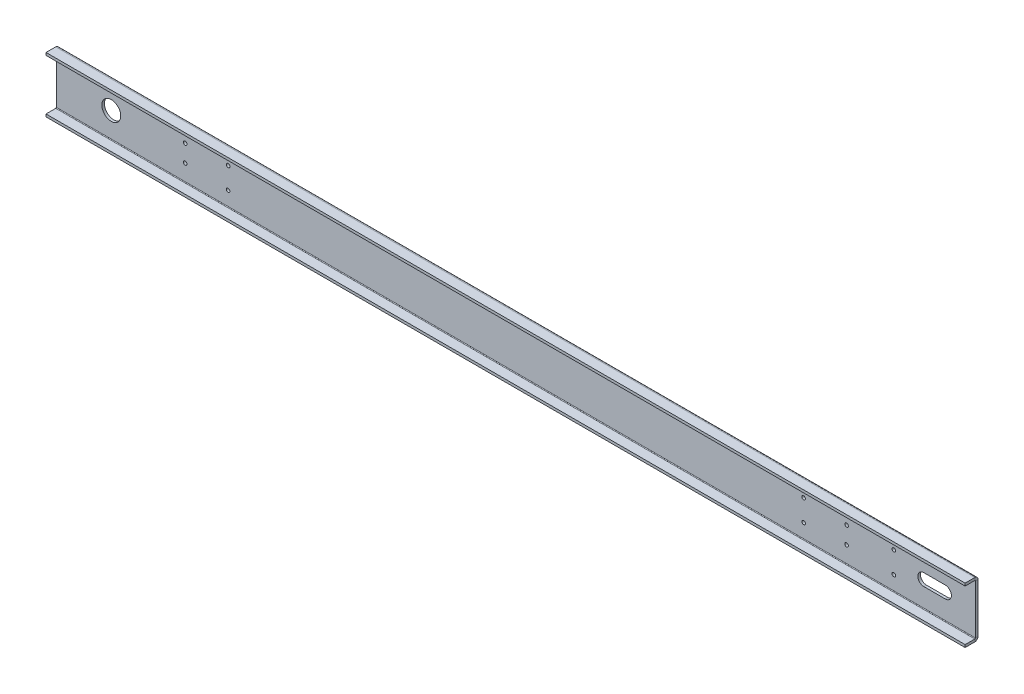
ISO-10303-21;
HEADER;
FILE_DESCRIPTION(('STEP AP214'),'2;1');
FILE_NAME('part.step','',(''),(''),'','','');
FILE_SCHEMA(('AUTOMOTIVE_DESIGN { 1 0 10303 214 1 1 1 1 }'));
ENDSEC;
DATA;
#1=APPLICATION_CONTEXT('core data for automotive mechanical design processes');
#2=APPLICATION_PROTOCOL_DEFINITION('international standard','automotive_design',2000,#1);
#3=PRODUCT_CONTEXT('',#1,'mechanical');
#4=PRODUCT('Part','Part','',(#3));
#5=PRODUCT_RELATED_PRODUCT_CATEGORY('part','',(#4));
#6=PRODUCT_DEFINITION_FORMATION('','',#4);
#7=PRODUCT_DEFINITION_CONTEXT('part definition',#1,'design');
#8=PRODUCT_DEFINITION('design','',#6,#7);
#9=PRODUCT_DEFINITION_SHAPE('','',#8);
#10=(LENGTH_UNIT() NAMED_UNIT(*) SI_UNIT(.MILLI.,.METRE.));
#11=(NAMED_UNIT(*) PLANE_ANGLE_UNIT() SI_UNIT($,.RADIAN.));
#12=(NAMED_UNIT(*) SI_UNIT($,.STERADIAN.) SOLID_ANGLE_UNIT());
#13=UNCERTAINTY_MEASURE_WITH_UNIT(LENGTH_MEASURE(1.E-05),#10,'distance_accuracy_value','');
#14=(GEOMETRIC_REPRESENTATION_CONTEXT(3) GLOBAL_UNCERTAINTY_ASSIGNED_CONTEXT((#13)) GLOBAL_UNIT_ASSIGNED_CONTEXT((#10,
#11,#12)) REPRESENTATION_CONTEXT('',''));
#15=CARTESIAN_POINT('',(0.,0.,0.));
#16=DIRECTION('',(0.,0.,1.));
#17=DIRECTION('',(1.,0.,0.));
#18=AXIS2_PLACEMENT_3D('',#15,#16,#17);
#19=CARTESIAN_POINT('',(535.,28.7634,0.));
#20=DIRECTION('',(1.,0.,0.));
#21=DIRECTION('',(0.,0.,-1.));
#22=AXIS2_PLACEMENT_3D('',#19,#20,#21);
#23=PLANE('',#22);
#24=DIRECTION('',(0.,0.,1.));
#25=VECTOR('',#24,1.);
#26=CARTESIAN_POINT('',(535.,28.7634,0.));
#27=LINE('',#26,#25);
#28=CARTESIAN_POINT('',(535.,28.7634,0.));
#29=VERTEX_POINT('',#28);
#30=CARTESIAN_POINT('',(535.,28.7634,3.));
#31=VERTEX_POINT('',#30);
#32=EDGE_CURVE('E300',#29,#31,#27,.T.);
#33=ORIENTED_EDGE('',*,*,#32,.F.);
#34=CARTESIAN_POINT('',(535.,28.7634,3.7366));
#35=DIRECTION('',(1.,0.,0.));
#36=DIRECTION('',(0.,0.,-1.));
#37=AXIS2_PLACEMENT_3D('',#34,#35,#36);
#38=CIRCLE('',#37,3.7366);
#39=CARTESIAN_POINT('',(535.,32.5,3.7366));
#40=VERTEX_POINT('',#39);
#41=EDGE_CURVE('E199',#40,#29,#38,.F.);
#42=ORIENTED_EDGE('',*,*,#41,.F.);
#43=DIRECTION('',(0.,1.,0.));
#44=VECTOR('',#43,1.);
#45=CARTESIAN_POINT('',(535.,29.5,3.7366));
#46=LINE('',#45,#44);
#47=CARTESIAN_POINT('',(535.,29.5,3.7366));
#48=VERTEX_POINT('',#47);
#49=EDGE_CURVE('E298',#48,#40,#46,.T.);
#50=ORIENTED_EDGE('',*,*,#49,.F.);
#51=CARTESIAN_POINT('',(535.,28.7634,3.7366));
#52=DIRECTION('',(1.,0.,0.));
#53=DIRECTION('',(0.,0.,-1.));
#54=AXIS2_PLACEMENT_3D('',#51,#52,#53);
#55=CIRCLE('',#54,0.7366);
#56=EDGE_CURVE('E211',#48,#31,#55,.F.);
#57=ORIENTED_EDGE('',*,*,#56,.T.);
#58=EDGE_LOOP('',(#33,#42,#50,#57));
#59=FACE_BOUND('',#58,.T.);
#60=ADVANCED_FACE('F41',(#59),#23,.T.);
#61=CARTESIAN_POINT('',(535.,29.5,3.7366));
#62=DIRECTION('',(1.,0.,0.));
#63=DIRECTION('',(0.,0.,-1.));
#64=AXIS2_PLACEMENT_3D('',#61,#62,#63);
#65=PLANE('',#64);
#66=DIRECTION('',(0.,-1.,0.));
#67=VECTOR('',#66,1.);
#68=CARTESIAN_POINT('',(535.,-32.5,0.));
#69=LINE('',#68,#67);
#70=CARTESIAN_POINT('',(535.,-28.7634,0.));
#71=VERTEX_POINT('',#70);
#72=EDGE_CURVE('E196',#29,#71,#69,.T.);
#73=ORIENTED_EDGE('',*,*,#72,.F.);
#74=ORIENTED_EDGE('',*,*,#32,.T.);
#75=DIRECTION('',(0.,1.,0.));
#76=VECTOR('',#75,1.);
#77=CARTESIAN_POINT('',(535.,-32.5,3.));
#78=LINE('',#77,#76);
#79=CARTESIAN_POINT('',(535.,-28.7634,3.));
#80=VERTEX_POINT('',#79);
#81=EDGE_CURVE('E214',#31,#80,#78,.F.);
#82=ORIENTED_EDGE('',*,*,#81,.T.);
#83=DIRECTION('',(0.,0.,-1.));
#84=VECTOR('',#83,1.);
#85=CARTESIAN_POINT('',(535.,-28.7634,3.));
#86=LINE('',#85,#84);
#87=EDGE_CURVE('E290',#80,#71,#86,.T.);
#88=ORIENTED_EDGE('',*,*,#87,.T.);
#89=EDGE_LOOP('',(#73,#74,#82,#88));
#90=FACE_BOUND('',#89,.T.);
#91=ADVANCED_FACE('F392',(#90),#65,.T.);
#92=CARTESIAN_POINT('',(-535.,32.5,3.7366));
#93=DIRECTION('',(-1.,0.,0.));
#94=DIRECTION('',(0.,0.,1.));
#95=AXIS2_PLACEMENT_3D('',#92,#93,#94);
#96=PLANE('',#95);
#97=DIRECTION('',(0.,-1.,0.));
#98=VECTOR('',#97,1.);
#99=CARTESIAN_POINT('',(-535.,32.5,3.7366));
#100=LINE('',#99,#98);
#101=CARTESIAN_POINT('',(-535.,32.5,3.7366));
#102=VERTEX_POINT('',#101);
#103=CARTESIAN_POINT('',(-535.,29.5,3.7366));
#104=VERTEX_POINT('',#103);
#105=EDGE_CURVE('E296',#102,#104,#100,.T.);
#106=ORIENTED_EDGE('',*,*,#105,.F.);
#107=CARTESIAN_POINT('',(-535.,28.7634,3.7366));
#108=DIRECTION('',(1.,0.,0.));
#109=DIRECTION('',(0.,0.,-1.));
#110=AXIS2_PLACEMENT_3D('',#107,#108,#109);
#111=CIRCLE('',#110,3.7366);
#112=CARTESIAN_POINT('',(-535.,28.7634,0.));
#113=VERTEX_POINT('',#112);
#114=EDGE_CURVE('E235',#102,#113,#111,.F.);
#115=ORIENTED_EDGE('',*,*,#114,.T.);
#116=DIRECTION('',(0.,0.,-1.));
#117=VECTOR('',#116,1.);
#118=CARTESIAN_POINT('',(-535.,28.7634,3.));
#119=LINE('',#118,#117);
#120=CARTESIAN_POINT('',(-535.,28.7634,3.));
#121=VERTEX_POINT('',#120);
#122=EDGE_CURVE('E294',#121,#113,#119,.T.);
#123=ORIENTED_EDGE('',*,*,#122,.F.);
#124=CARTESIAN_POINT('',(-535.,28.7634,3.7366));
#125=DIRECTION('',(1.,0.,0.));
#126=DIRECTION('',(0.,0.,-1.));
#127=AXIS2_PLACEMENT_3D('',#124,#125,#126);
#128=CIRCLE('',#127,0.7366);
#129=EDGE_CURVE('E247',#104,#121,#128,.F.);
#130=ORIENTED_EDGE('',*,*,#129,.F.);
#131=EDGE_LOOP('',(#106,#115,#123,#130));
#132=FACE_BOUND('',#131,.T.);
#133=ADVANCED_FACE('F397',(#132),#96,.T.);
#134=CARTESIAN_POINT('',(-535.,28.7634,3.));
#135=DIRECTION('',(-1.,0.,0.));
#136=DIRECTION('',(0.,0.,1.));
#137=AXIS2_PLACEMENT_3D('',#134,#135,#136);
#138=PLANE('',#137);
#139=DIRECTION('',(0.,0.,-1.));
#140=VECTOR('',#139,1.);
#141=CARTESIAN_POINT('',(-535.,32.5,0.));
#142=LINE('',#141,#140);
#143=CARTESIAN_POINT('',(-535.,32.5,15.));
#144=VERTEX_POINT('',#143);
#145=EDGE_CURVE('E238',#144,#102,#142,.T.);
#146=ORIENTED_EDGE('',*,*,#145,.T.);
#147=ORIENTED_EDGE('',*,*,#105,.T.);
#148=DIRECTION('',(0.,0.,-1.));
#149=VECTOR('',#148,1.);
#150=CARTESIAN_POINT('',(-535.,29.5,0.));
#151=LINE('',#150,#149);
#152=CARTESIAN_POINT('',(-535.,29.5,15.));
#153=VERTEX_POINT('',#152);
#154=EDGE_CURVE('E244',#153,#104,#151,.T.);
#155=ORIENTED_EDGE('',*,*,#154,.F.);
#156=DIRECTION('',(0.,1.,0.));
#157=VECTOR('',#156,1.);
#158=CARTESIAN_POINT('',(-535.,29.5,15.));
#159=LINE('',#158,#157);
#160=EDGE_CURVE('E241',#153,#144,#159,.T.);
#161=ORIENTED_EDGE('',*,*,#160,.T.);
#162=EDGE_LOOP('',(#146,#147,#155,#161));
#163=FACE_BOUND('',#162,.T.);
#164=ADVANCED_FACE('F451',(#163),#138,.T.);
#165=CARTESIAN_POINT('',(535.,-32.5,3.7366));
#166=DIRECTION('',(1.,0.,0.));
#167=DIRECTION('',(0.,0.,-1.));
#168=AXIS2_PLACEMENT_3D('',#165,#166,#167);
#169=PLANE('',#168);
#170=DIRECTION('',(0.,1.,0.));
#171=VECTOR('',#170,1.);
#172=CARTESIAN_POINT('',(535.,-32.5,3.7366));
#173=LINE('',#172,#171);
#174=CARTESIAN_POINT('',(535.,-32.5,3.7366));
#175=VERTEX_POINT('',#174);
#176=CARTESIAN_POINT('',(535.,-29.5,3.7366));
#177=VERTEX_POINT('',#176);
#178=EDGE_CURVE('E292',#175,#177,#173,.T.);
#179=ORIENTED_EDGE('',*,*,#178,.F.);
#180=CARTESIAN_POINT('',(535.,-28.7634,3.7366));
#181=DIRECTION('',(1.,0.,0.));
#182=DIRECTION('',(0.,0.,-1.));
#183=AXIS2_PLACEMENT_3D('',#180,#181,#182);
#184=CIRCLE('',#183,3.7366);
#185=EDGE_CURVE('E193',#71,#175,#184,.F.);
#186=ORIENTED_EDGE('',*,*,#185,.F.);
#187=ORIENTED_EDGE('',*,*,#87,.F.);
#188=CARTESIAN_POINT('',(535.,-28.7634,3.7366));
#189=DIRECTION('',(1.,0.,0.));
#190=DIRECTION('',(0.,0.,-1.));
#191=AXIS2_PLACEMENT_3D('',#188,#189,#190);
#192=CIRCLE('',#191,0.7366);
#193=EDGE_CURVE('E217',#80,#177,#192,.F.);
#194=ORIENTED_EDGE('',*,*,#193,.T.);
#195=EDGE_LOOP('',(#179,#186,#187,#194));
#196=FACE_BOUND('',#195,.T.);
#197=ADVANCED_FACE('F439',(#196),#169,.T.);
#198=CARTESIAN_POINT('',(535.,-28.7634,3.));
#199=DIRECTION('',(1.,0.,0.));
#200=DIRECTION('',(0.,0.,-1.));
#201=AXIS2_PLACEMENT_3D('',#198,#199,#200);
#202=PLANE('',#201);
#203=DIRECTION('',(0.,0.,1.));
#204=VECTOR('',#203,1.);
#205=CARTESIAN_POINT('',(535.,-32.5,0.));
#206=LINE('',#205,#204);
#207=CARTESIAN_POINT('',(535.,-32.5,15.));
#208=VERTEX_POINT('',#207);
#209=EDGE_CURVE('E190',#175,#208,#206,.T.);
#210=ORIENTED_EDGE('',*,*,#209,.F.);
#211=ORIENTED_EDGE('',*,*,#178,.T.);
#212=DIRECTION('',(0.,0.,-1.));
#213=VECTOR('',#212,1.);
#214=CARTESIAN_POINT('',(535.,-29.5,0.));
#215=LINE('',#214,#213);
#216=CARTESIAN_POINT('',(535.,-29.5,15.));
#217=VERTEX_POINT('',#216);
#218=EDGE_CURVE('E184',#177,#217,#215,.F.);
#219=ORIENTED_EDGE('',*,*,#218,.T.);
#220=DIRECTION('',(0.,1.,0.));
#221=VECTOR('',#220,1.);
#222=CARTESIAN_POINT('',(535.,-32.5,15.));
#223=LINE('',#222,#221);
#224=EDGE_CURVE('E186',#208,#217,#223,.T.);
#225=ORIENTED_EDGE('',*,*,#224,.F.);
#226=EDGE_LOOP('',(#210,#211,#219,#225));
#227=FACE_BOUND('',#226,.T.);
#228=ADVANCED_FACE('F458',(#227),#202,.T.);
#229=CARTESIAN_POINT('',(-535.,-28.7634,0.));
#230=DIRECTION('',(-1.,0.,0.));
#231=DIRECTION('',(0.,0.,1.));
#232=AXIS2_PLACEMENT_3D('',#229,#230,#231);
#233=PLANE('',#232);
#234=DIRECTION('',(0.,0.,1.));
#235=VECTOR('',#234,1.);
#236=CARTESIAN_POINT('',(-535.,-28.7634,0.));
#237=LINE('',#236,#235);
#238=CARTESIAN_POINT('',(-535.,-28.7634,0.));
#239=VERTEX_POINT('',#238);
#240=CARTESIAN_POINT('',(-535.,-28.7634,3.));
#241=VERTEX_POINT('',#240);
#242=EDGE_CURVE('E288',#239,#241,#237,.T.);
#243=ORIENTED_EDGE('',*,*,#242,.F.);
#244=CARTESIAN_POINT('',(-535.,-28.7634,3.7366));
#245=DIRECTION('',(1.,0.,0.));
#246=DIRECTION('',(0.,0.,-1.));
#247=AXIS2_PLACEMENT_3D('',#244,#245,#246);
#248=CIRCLE('',#247,3.7366);
#249=CARTESIAN_POINT('',(-535.,-32.5,3.7366));
#250=VERTEX_POINT('',#249);
#251=EDGE_CURVE('E229',#239,#250,#248,.F.);
#252=ORIENTED_EDGE('',*,*,#251,.T.);
#253=DIRECTION('',(0.,-1.,0.));
#254=VECTOR('',#253,1.);
#255=CARTESIAN_POINT('',(-535.,-29.5,3.7366));
#256=LINE('',#255,#254);
#257=CARTESIAN_POINT('',(-535.,-29.5,3.7366));
#258=VERTEX_POINT('',#257);
#259=EDGE_CURVE('E286',#258,#250,#256,.T.);
#260=ORIENTED_EDGE('',*,*,#259,.F.);
#261=CARTESIAN_POINT('',(-535.,-28.7634,3.7366));
#262=DIRECTION('',(1.,0.,0.));
#263=DIRECTION('',(0.,0.,-1.));
#264=AXIS2_PLACEMENT_3D('',#261,#262,#263);
#265=CIRCLE('',#264,0.7366);
#266=EDGE_CURVE('E187',#241,#258,#265,.F.);
#267=ORIENTED_EDGE('',*,*,#266,.F.);
#268=EDGE_LOOP('',(#243,#252,#260,#267));
#269=FACE_BOUND('',#268,.T.);
#270=ADVANCED_FACE('F464',(#269),#233,.T.);
#271=CARTESIAN_POINT('',(-535.,-29.5,3.7366));
#272=DIRECTION('',(-1.,0.,0.));
#273=DIRECTION('',(0.,0.,1.));
#274=AXIS2_PLACEMENT_3D('',#271,#272,#273);
#275=PLANE('',#274);
#276=DIRECTION('',(0.,-1.,0.));
#277=VECTOR('',#276,1.);
#278=CARTESIAN_POINT('',(-535.,-32.5,0.));
#279=LINE('',#278,#277);
#280=EDGE_CURVE('E232',#113,#239,#279,.T.);
#281=ORIENTED_EDGE('',*,*,#280,.T.);
#282=ORIENTED_EDGE('',*,*,#242,.T.);
#283=DIRECTION('',(0.,1.,0.));
#284=VECTOR('',#283,1.);
#285=CARTESIAN_POINT('',(-535.,-32.5,3.));
#286=LINE('',#285,#284);
#287=EDGE_CURVE('E250',#121,#241,#286,.F.);
#288=ORIENTED_EDGE('',*,*,#287,.F.);
#289=ORIENTED_EDGE('',*,*,#122,.T.);
#290=EDGE_LOOP('',(#281,#282,#288,#289));
#291=FACE_BOUND('',#290,.T.);
#292=ADVANCED_FACE('F448',(#291),#275,.T.);
#293=CARTESIAN_POINT('',(535.,-29.5,0.));
#294=DIRECTION('',(0.,-1.,0.));
#295=DIRECTION('',(0.,0.,-1.));
#296=AXIS2_PLACEMENT_3D('',#293,#294,#295);
#297=PLANE('',#296);
#298=DIRECTION('',(0.,0.,-1.));
#299=VECTOR('',#298,1.);
#300=CARTESIAN_POINT('',(-535.,-29.5,0.));
#301=LINE('',#300,#299);
#302=CARTESIAN_POINT('',(-535.,-29.5,15.));
#303=VERTEX_POINT('',#302);
#304=EDGE_CURVE('E181',#258,#303,#301,.F.);
#305=ORIENTED_EDGE('',*,*,#304,.T.);
#306=DIRECTION('',(-1.,0.,0.));
#307=VECTOR('',#306,1.);
#308=CARTESIAN_POINT('',(535.,-29.5,15.));
#309=LINE('',#308,#307);
#310=EDGE_CURVE('E284',#217,#303,#309,.T.);
#311=ORIENTED_EDGE('',*,*,#310,.F.);
#312=ORIENTED_EDGE('',*,*,#218,.F.);
#313=DIRECTION('',(-1.,0.,0.));
#314=VECTOR('',#313,1.);
#315=CARTESIAN_POINT('',(535.,-29.5,3.7366));
#316=LINE('',#315,#314);
#317=EDGE_CURVE('E220',#177,#258,#316,.T.);
#318=ORIENTED_EDGE('',*,*,#317,.T.);
#319=EDGE_LOOP('',(#305,#311,#312,#318));
#320=FACE_BOUND('',#319,.T.);
#321=ADVANCED_FACE('F470',(#320),#297,.F.);
#322=CARTESIAN_POINT('',(535.,-32.5,15.));
#323=DIRECTION('',(0.,0.,1.));
#324=DIRECTION('',(1.,0.,0.));
#325=AXIS2_PLACEMENT_3D('',#322,#323,#324);
#326=PLANE('',#325);
#327=DIRECTION('',(0.,1.,0.));
#328=VECTOR('',#327,1.);
#329=CARTESIAN_POINT('',(-535.,-32.5,15.));
#330=LINE('',#329,#328);
#331=CARTESIAN_POINT('',(-535.,-32.5,15.));
#332=VERTEX_POINT('',#331);
#333=EDGE_CURVE('E223',#332,#303,#330,.T.);
#334=ORIENTED_EDGE('',*,*,#333,.F.);
#335=DIRECTION('',(-1.,0.,0.));
#336=VECTOR('',#335,1.);
#337=CARTESIAN_POINT('',(535.,-32.5,15.));
#338=LINE('',#337,#336);
#339=EDGE_CURVE('E282',#208,#332,#338,.T.);
#340=ORIENTED_EDGE('',*,*,#339,.F.);
#341=ORIENTED_EDGE('',*,*,#224,.T.);
#342=ORIENTED_EDGE('',*,*,#310,.T.);
#343=EDGE_LOOP('',(#334,#340,#341,#342));
#344=FACE_BOUND('',#343,.T.);
#345=ADVANCED_FACE('F473',(#344),#326,.T.);
#346=CARTESIAN_POINT('',(535.,-32.5,0.));
#347=DIRECTION('',(0.,-1.,0.));
#348=DIRECTION('',(0.,0.,-1.));
#349=AXIS2_PLACEMENT_3D('',#346,#347,#348);
#350=PLANE('',#349);
#351=DIRECTION('',(0.,0.,1.));
#352=VECTOR('',#351,1.);
#353=CARTESIAN_POINT('',(-535.,-32.5,0.));
#354=LINE('',#353,#352);
#355=EDGE_CURVE('E226',#250,#332,#354,.T.);
#356=ORIENTED_EDGE('',*,*,#355,.F.);
#357=DIRECTION('',(-1.,0.,0.));
#358=VECTOR('',#357,1.);
#359=CARTESIAN_POINT('',(535.,-32.5,3.7366));
#360=LINE('',#359,#358);
#361=EDGE_CURVE('E279',#175,#250,#360,.T.);
#362=ORIENTED_EDGE('',*,*,#361,.F.);
#363=ORIENTED_EDGE('',*,*,#209,.T.);
#364=ORIENTED_EDGE('',*,*,#339,.T.);
#365=EDGE_LOOP('',(#356,#362,#363,#364));
#366=FACE_BOUND('',#365,.T.);
#367=ADVANCED_FACE('F477',(#366),#350,.T.);
#368=CARTESIAN_POINT('',(535.,-28.7634,3.7366));
#369=DIRECTION('',(-1.,0.,0.));
#370=DIRECTION('',(0.,0.,1.));
#371=AXIS2_PLACEMENT_3D('',#368,#369,#370);
#372=CYLINDRICAL_SURFACE('',#371,3.7366);
#373=ORIENTED_EDGE('',*,*,#251,.F.);
#374=DIRECTION('',(-1.,0.,0.));
#375=VECTOR('',#374,1.);
#376=CARTESIAN_POINT('',(535.,-28.7634,0.));
#377=LINE('',#376,#375);
#378=EDGE_CURVE('E276',#71,#239,#377,.T.);
#379=ORIENTED_EDGE('',*,*,#378,.F.);
#380=ORIENTED_EDGE('',*,*,#185,.T.);
#381=ORIENTED_EDGE('',*,*,#361,.T.);
#382=EDGE_LOOP('',(#373,#379,#380,#381));
#383=FACE_BOUND('',#382,.T.);
#384=ADVANCED_FACE('F444',(#383),#372,.T.);
#385=CARTESIAN_POINT('',(535.,-32.5,0.));
#386=DIRECTION('',(0.,0.,-1.));
#387=DIRECTION('',(-1.,0.,0.));
#388=AXIS2_PLACEMENT_3D('',#385,#386,#387);
#389=PLANE('',#388);
#390=CARTESIAN_POINT('',(-471.,0.,0.));
#391=DIRECTION('',(0.,0.,-1.));
#392=DIRECTION('',(-1.,0.,0.));
#393=AXIS2_PLACEMENT_3D('',#390,#391,#392);
#394=CIRCLE('',#393,11.);
#395=CARTESIAN_POINT('',(-482.,0.,0.));
#396=VERTEX_POINT('',#395);
#397=EDGE_CURVE('E328',#396,#396,#394,.T.);
#398=ORIENTED_EDGE('',*,*,#397,.F.);
#399=EDGE_LOOP('',(#398));
#400=FACE_BOUND('',#399,.T.);
#401=CARTESIAN_POINT('',(-335.,12.5,0.));
#402=DIRECTION('',(0.,0.,-1.));
#403=DIRECTION('',(-1.,0.,0.));
#404=AXIS2_PLACEMENT_3D('',#401,#402,#403);
#405=CIRCLE('',#404,2.09999999999999);
#406=CARTESIAN_POINT('',(-337.1,12.5,0.));
#407=VERTEX_POINT('',#406);
#408=EDGE_CURVE('E318',#407,#407,#405,.T.);
#409=ORIENTED_EDGE('',*,*,#408,.F.);
#410=EDGE_LOOP('',(#409));
#411=FACE_BOUND('',#410,.T.);
#412=CARTESIAN_POINT('',(-335.,-12.5,0.));
#413=DIRECTION('',(0.,0.,-1.));
#414=DIRECTION('',(-1.,0.,0.));
#415=AXIS2_PLACEMENT_3D('',#412,#413,#414);
#416=CIRCLE('',#415,2.09999999999999);
#417=CARTESIAN_POINT('',(-337.1,-12.5,0.));
#418=VERTEX_POINT('',#417);
#419=EDGE_CURVE('E315',#418,#418,#416,.T.);
#420=ORIENTED_EDGE('',*,*,#419,.F.);
#421=EDGE_LOOP('',(#420));
#422=FACE_BOUND('',#421,.T.);
#423=CARTESIAN_POINT('',(-385.,10.,0.));
#424=DIRECTION('',(0.,0.,-1.));
#425=DIRECTION('',(-1.,0.,0.));
#426=AXIS2_PLACEMENT_3D('',#423,#424,#425);
#427=CIRCLE('',#426,2.09999999999999);
#428=CARTESIAN_POINT('',(-387.1,10.,0.));
#429=VERTEX_POINT('',#428);
#430=EDGE_CURVE('E314',#429,#429,#427,.T.);
#431=ORIENTED_EDGE('',*,*,#430,.F.);
#432=EDGE_LOOP('',(#431));
#433=FACE_BOUND('',#432,.T.);
#434=CARTESIAN_POINT('',(-385.,-10.,0.));
#435=DIRECTION('',(0.,0.,-1.));
#436=DIRECTION('',(-1.,0.,0.));
#437=AXIS2_PLACEMENT_3D('',#434,#435,#436);
#438=CIRCLE('',#437,2.09999999999999);
#439=CARTESIAN_POINT('',(-387.1,-10.,0.));
#440=VERTEX_POINT('',#439);
#441=EDGE_CURVE('E336',#440,#440,#438,.T.);
#442=ORIENTED_EDGE('',*,*,#441,.F.);
#443=EDGE_LOOP('',(#442));
#444=FACE_BOUND('',#443,.T.);
#445=CARTESIAN_POINT('',(335.,12.5,0.));
#446=DIRECTION('',(0.,0.,-1.));
#447=DIRECTION('',(-1.,0.,0.));
#448=AXIS2_PLACEMENT_3D('',#445,#446,#447);
#449=CIRCLE('',#448,2.09999999999999);
#450=CARTESIAN_POINT('',(332.9,12.5,0.));
#451=VERTEX_POINT('',#450);
#452=EDGE_CURVE('E342',#451,#451,#449,.T.);
#453=ORIENTED_EDGE('',*,*,#452,.F.);
#454=EDGE_LOOP('',(#453));
#455=FACE_BOUND('',#454,.T.);
#456=CARTESIAN_POINT('',(335.,-12.5,0.));
#457=DIRECTION('',(0.,0.,-1.));
#458=DIRECTION('',(-1.,0.,0.));
#459=AXIS2_PLACEMENT_3D('',#456,#457,#458);
#460=CIRCLE('',#459,2.09999999999999);
#461=CARTESIAN_POINT('',(332.9,-12.5,0.));
#462=VERTEX_POINT('',#461);
#463=EDGE_CURVE('E348',#462,#462,#460,.T.);
#464=ORIENTED_EDGE('',*,*,#463,.F.);
#465=EDGE_LOOP('',(#464));
#466=FACE_BOUND('',#465,.T.);
#467=CARTESIAN_POINT('',(385.,10.,0.));
#468=DIRECTION('',(0.,0.,-1.));
#469=DIRECTION('',(-1.,0.,0.));
#470=AXIS2_PLACEMENT_3D('',#467,#468,#469);
#471=CIRCLE('',#470,2.09999999999999);
#472=CARTESIAN_POINT('',(382.9,10.,0.));
#473=VERTEX_POINT('',#472);
#474=EDGE_CURVE('E354',#473,#473,#471,.T.);
#475=ORIENTED_EDGE('',*,*,#474,.F.);
#476=EDGE_LOOP('',(#475));
#477=FACE_BOUND('',#476,.T.);
#478=CARTESIAN_POINT('',(385.,-10.,0.));
#479=DIRECTION('',(0.,0.,-1.));
#480=DIRECTION('',(-1.,0.,0.));
#481=AXIS2_PLACEMENT_3D('',#478,#479,#480);
#482=CIRCLE('',#481,2.09999999999999);
#483=CARTESIAN_POINT('',(382.9,-10.,0.));
#484=VERTEX_POINT('',#483);
#485=EDGE_CURVE('E360',#484,#484,#482,.T.);
#486=ORIENTED_EDGE('',*,*,#485,.F.);
#487=EDGE_LOOP('',(#486));
#488=FACE_BOUND('',#487,.T.);
#489=CARTESIAN_POINT('',(440.,12.5,0.));
#490=DIRECTION('',(0.,0.,-1.));
#491=DIRECTION('',(-1.,0.,0.));
#492=AXIS2_PLACEMENT_3D('',#489,#490,#491);
#493=CIRCLE('',#492,2.09999999999999);
#494=CARTESIAN_POINT('',(437.9,12.5,0.));
#495=VERTEX_POINT('',#494);
#496=EDGE_CURVE('E311',#495,#495,#493,.T.);
#497=ORIENTED_EDGE('',*,*,#496,.F.);
#498=EDGE_LOOP('',(#497));
#499=FACE_BOUND('',#498,.T.);
#500=CARTESIAN_POINT('',(440.,-12.5,0.));
#501=DIRECTION('',(0.,0.,-1.));
#502=DIRECTION('',(-1.,0.,0.));
#503=AXIS2_PLACEMENT_3D('',#500,#501,#502);
#504=CIRCLE('',#503,2.09999999999999);
#505=CARTESIAN_POINT('',(437.9,-12.5,0.));
#506=VERTEX_POINT('',#505);
#507=EDGE_CURVE('E310',#506,#506,#504,.T.);
#508=ORIENTED_EDGE('',*,*,#507,.F.);
#509=EDGE_LOOP('',(#508));
#510=FACE_BOUND('',#509,.T.);
#511=CARTESIAN_POINT('',(500.,0.,0.));
#512=DIRECTION('',(0.,0.,-1.));
#513=DIRECTION('',(-1.,0.,0.));
#514=AXIS2_PLACEMENT_3D('',#511,#512,#513);
#515=CIRCLE('',#514,7.);
#516=CARTESIAN_POINT('',(500.,7.,0.));
#517=VERTEX_POINT('',#516);
#518=CARTESIAN_POINT('',(500.,-7.,0.));
#519=VERTEX_POINT('',#518);
#520=EDGE_CURVE('E57',#517,#519,#515,.T.);
#521=ORIENTED_EDGE('',*,*,#520,.F.);
#522=DIRECTION('',(1.,0.,0.));
#523=VECTOR('',#522,1.);
#524=CARTESIAN_POINT('',(500.,7.,0.));
#525=LINE('',#524,#523);
#526=CARTESIAN_POINT('',(475.,7.,0.));
#527=VERTEX_POINT('',#526);
#528=EDGE_CURVE('E174',#527,#517,#525,.T.);
#529=ORIENTED_EDGE('',*,*,#528,.F.);
#530=CARTESIAN_POINT('',(475.,0.,0.));
#531=DIRECTION('',(0.,0.,-1.));
#532=DIRECTION('',(-1.,0.,0.));
#533=AXIS2_PLACEMENT_3D('',#530,#531,#532);
#534=CIRCLE('',#533,7.);
#535=CARTESIAN_POINT('',(475.,-7.,0.));
#536=VERTEX_POINT('',#535);
#537=EDGE_CURVE('E158',#536,#527,#534,.T.);
#538=ORIENTED_EDGE('',*,*,#537,.F.);
#539=DIRECTION('',(-1.,0.,0.));
#540=VECTOR('',#539,1.);
#541=CARTESIAN_POINT('',(500.,-7.,0.));
#542=LINE('',#541,#540);
#543=EDGE_CURVE('E167',#519,#536,#542,.T.);
#544=ORIENTED_EDGE('',*,*,#543,.F.);
#545=EDGE_LOOP('',(#521,#529,#538,#544));
#546=FACE_BOUND('',#545,.T.);
#547=ORIENTED_EDGE('',*,*,#280,.F.);
#548=DIRECTION('',(-1.,0.,0.));
#549=VECTOR('',#548,1.);
#550=CARTESIAN_POINT('',(535.,28.7634,0.));
#551=LINE('',#550,#549);
#552=EDGE_CURVE('E273',#29,#113,#551,.T.);
#553=ORIENTED_EDGE('',*,*,#552,.F.);
#554=ORIENTED_EDGE('',*,*,#72,.T.);
#555=ORIENTED_EDGE('',*,*,#378,.T.);
#556=EDGE_LOOP('',(#547,#553,#554,#555));
#557=FACE_BOUND('',#556,.T.);
#558=ADVANCED_FACE('F171',(#400,#411,#422,#433,#444,#455,#466,#477,#488,#499,#510,#546,#557),
#389,.T.);
#559=CARTESIAN_POINT('',(535.,28.7634,3.7366));
#560=DIRECTION('',(-1.,0.,0.));
#561=DIRECTION('',(0.,0.,1.));
#562=AXIS2_PLACEMENT_3D('',#559,#560,#561);
#563=CYLINDRICAL_SURFACE('',#562,3.7366);
#564=ORIENTED_EDGE('',*,*,#114,.F.);
#565=DIRECTION('',(-1.,0.,0.));
#566=VECTOR('',#565,1.);
#567=CARTESIAN_POINT('',(535.,32.5,3.7366));
#568=LINE('',#567,#566);
#569=EDGE_CURVE('E270',#40,#102,#568,.T.);
#570=ORIENTED_EDGE('',*,*,#569,.F.);
#571=ORIENTED_EDGE('',*,*,#41,.T.);
#572=ORIENTED_EDGE('',*,*,#552,.T.);
#573=EDGE_LOOP('',(#564,#570,#571,#572));
#574=FACE_BOUND('',#573,.T.);
#575=ADVANCED_FACE('F409',(#574),#563,.T.);
#576=CARTESIAN_POINT('',(535.,32.5,0.));
#577=DIRECTION('',(0.,1.,0.));
#578=DIRECTION('',(0.,0.,1.));
#579=AXIS2_PLACEMENT_3D('',#576,#577,#578);
#580=PLANE('',#579);
#581=ORIENTED_EDGE('',*,*,#145,.F.);
#582=DIRECTION('',(-1.,0.,0.));
#583=VECTOR('',#582,1.);
#584=CARTESIAN_POINT('',(535.,32.5,15.));
#585=LINE('',#584,#583);
#586=CARTESIAN_POINT('',(535.,32.5,15.));
#587=VERTEX_POINT('',#586);
#588=EDGE_CURVE('E268',#587,#144,#585,.T.);
#589=ORIENTED_EDGE('',*,*,#588,.F.);
#590=DIRECTION('',(0.,0.,-1.));
#591=VECTOR('',#590,1.);
#592=CARTESIAN_POINT('',(535.,32.5,0.));
#593=LINE('',#592,#591);
#594=EDGE_CURVE('E202',#587,#40,#593,.T.);
#595=ORIENTED_EDGE('',*,*,#594,.T.);
#596=ORIENTED_EDGE('',*,*,#569,.T.);
#597=EDGE_LOOP('',(#581,#589,#595,#596));
#598=FACE_BOUND('',#597,.T.);
#599=ADVANCED_FACE('F412',(#598),#580,.T.);
#600=CARTESIAN_POINT('',(535.,29.5,15.));
#601=DIRECTION('',(0.,0.,1.));
#602=DIRECTION('',(1.,0.,0.));
#603=AXIS2_PLACEMENT_3D('',#600,#601,#602);
#604=PLANE('',#603);
#605=ORIENTED_EDGE('',*,*,#160,.F.);
#606=DIRECTION('',(-1.,0.,0.));
#607=VECTOR('',#606,1.);
#608=CARTESIAN_POINT('',(535.,29.5,15.));
#609=LINE('',#608,#607);
#610=CARTESIAN_POINT('',(535.,29.5,15.));
#611=VERTEX_POINT('',#610);
#612=EDGE_CURVE('E266',#611,#153,#609,.T.);
#613=ORIENTED_EDGE('',*,*,#612,.F.);
#614=DIRECTION('',(0.,1.,0.));
#615=VECTOR('',#614,1.);
#616=CARTESIAN_POINT('',(535.,29.5,15.));
#617=LINE('',#616,#615);
#618=EDGE_CURVE('E205',#611,#587,#617,.T.);
#619=ORIENTED_EDGE('',*,*,#618,.T.);
#620=ORIENTED_EDGE('',*,*,#588,.T.);
#621=EDGE_LOOP('',(#605,#613,#619,#620));
#622=FACE_BOUND('',#621,.T.);
#623=ADVANCED_FACE('F419',(#622),#604,.T.);
#624=CARTESIAN_POINT('',(535.,29.5,0.));
#625=DIRECTION('',(0.,1.,0.));
#626=DIRECTION('',(0.,0.,1.));
#627=AXIS2_PLACEMENT_3D('',#624,#625,#626);
#628=PLANE('',#627);
#629=ORIENTED_EDGE('',*,*,#154,.T.);
#630=DIRECTION('',(-1.,0.,0.));
#631=VECTOR('',#630,1.);
#632=CARTESIAN_POINT('',(535.,29.5,3.7366));
#633=LINE('',#632,#631);
#634=EDGE_CURVE('E263',#48,#104,#633,.T.);
#635=ORIENTED_EDGE('',*,*,#634,.F.);
#636=DIRECTION('',(0.,0.,-1.));
#637=VECTOR('',#636,1.);
#638=CARTESIAN_POINT('',(535.,29.5,0.));
#639=LINE('',#638,#637);
#640=EDGE_CURVE('E208',#611,#48,#639,.T.);
#641=ORIENTED_EDGE('',*,*,#640,.F.);
#642=ORIENTED_EDGE('',*,*,#612,.T.);
#643=EDGE_LOOP('',(#629,#635,#641,#642));
#644=FACE_BOUND('',#643,.T.);
#645=ADVANCED_FACE('F424',(#644),#628,.F.);
#646=CARTESIAN_POINT('',(535.,28.7634,3.7366));
#647=DIRECTION('',(-1.,0.,0.));
#648=DIRECTION('',(0.,0.,1.));
#649=AXIS2_PLACEMENT_3D('',#646,#647,#648);
#650=CYLINDRICAL_SURFACE('',#649,0.7366);
#651=ORIENTED_EDGE('',*,*,#129,.T.);
#652=DIRECTION('',(-1.,0.,0.));
#653=VECTOR('',#652,1.);
#654=CARTESIAN_POINT('',(535.,28.7634,3.));
#655=LINE('',#654,#653);
#656=EDGE_CURVE('E260',#31,#121,#655,.T.);
#657=ORIENTED_EDGE('',*,*,#656,.F.);
#658=ORIENTED_EDGE('',*,*,#56,.F.);
#659=ORIENTED_EDGE('',*,*,#634,.T.);
#660=EDGE_LOOP('',(#651,#657,#658,#659));
#661=FACE_BOUND('',#660,.T.);
#662=ADVANCED_FACE('F427',(#661),#650,.F.);
#663=CARTESIAN_POINT('',(535.,-32.5,3.));
#664=DIRECTION('',(0.,0.,-1.));
#665=DIRECTION('',(-1.,0.,0.));
#666=AXIS2_PLACEMENT_3D('',#663,#664,#665);
#667=PLANE('',#666);
#668=CARTESIAN_POINT('',(-471.,0.,3.));
#669=DIRECTION('',(0.,0.,-1.));
#670=DIRECTION('',(-1.,0.,0.));
#671=AXIS2_PLACEMENT_3D('',#668,#669,#670);
#672=CIRCLE('',#671,11.);
#673=CARTESIAN_POINT('',(-482.,0.,3.));
#674=VERTEX_POINT('',#673);
#675=EDGE_CURVE('E44',#674,#674,#672,.T.);
#676=ORIENTED_EDGE('',*,*,#675,.T.);
#677=EDGE_LOOP('',(#676));
#678=FACE_BOUND('',#677,.T.);
#679=CARTESIAN_POINT('',(-335.,12.5,3.));
#680=DIRECTION('',(0.,0.,-1.));
#681=DIRECTION('',(-1.,0.,0.));
#682=AXIS2_PLACEMENT_3D('',#679,#680,#681);
#683=CIRCLE('',#682,2.09999999999999);
#684=CARTESIAN_POINT('',(-337.1,12.5,3.));
#685=VERTEX_POINT('',#684);
#686=EDGE_CURVE('E316',#685,#685,#683,.T.);
#687=ORIENTED_EDGE('',*,*,#686,.T.);
#688=EDGE_LOOP('',(#687));
#689=FACE_BOUND('',#688,.T.);
#690=CARTESIAN_POINT('',(-335.,-12.5,3.));
#691=DIRECTION('',(0.,0.,-1.));
#692=DIRECTION('',(-1.,0.,0.));
#693=AXIS2_PLACEMENT_3D('',#690,#691,#692);
#694=CIRCLE('',#693,2.09999999999999);
#695=CARTESIAN_POINT('',(-337.1,-12.5,3.));
#696=VERTEX_POINT('',#695);
#697=EDGE_CURVE('E312',#696,#696,#694,.T.);
#698=ORIENTED_EDGE('',*,*,#697,.T.);
#699=EDGE_LOOP('',(#698));
#700=FACE_BOUND('',#699,.T.);
#701=CARTESIAN_POINT('',(-385.,10.,3.));
#702=DIRECTION('',(0.,0.,-1.));
#703=DIRECTION('',(-1.,0.,0.));
#704=AXIS2_PLACEMENT_3D('',#701,#702,#703);
#705=CIRCLE('',#704,2.09999999999999);
#706=CARTESIAN_POINT('',(-387.1,10.,3.));
#707=VERTEX_POINT('',#706);
#708=EDGE_CURVE('E333',#707,#707,#705,.T.);
#709=ORIENTED_EDGE('',*,*,#708,.T.);
#710=EDGE_LOOP('',(#709));
#711=FACE_BOUND('',#710,.T.);
#712=CARTESIAN_POINT('',(-385.,-10.,3.));
#713=DIRECTION('',(0.,0.,-1.));
#714=DIRECTION('',(-1.,0.,0.));
#715=AXIS2_PLACEMENT_3D('',#712,#713,#714);
#716=CIRCLE('',#715,2.09999999999999);
#717=CARTESIAN_POINT('',(-387.1,-10.,3.));
#718=VERTEX_POINT('',#717);
#719=EDGE_CURVE('E339',#718,#718,#716,.T.);
#720=ORIENTED_EDGE('',*,*,#719,.T.);
#721=EDGE_LOOP('',(#720));
#722=FACE_BOUND('',#721,.T.);
#723=CARTESIAN_POINT('',(335.,12.5,3.));
#724=DIRECTION('',(0.,0.,-1.));
#725=DIRECTION('',(-1.,0.,0.));
#726=AXIS2_PLACEMENT_3D('',#723,#724,#725);
#727=CIRCLE('',#726,2.09999999999999);
#728=CARTESIAN_POINT('',(332.9,12.5,3.));
#729=VERTEX_POINT('',#728);
#730=EDGE_CURVE('E345',#729,#729,#727,.T.);
#731=ORIENTED_EDGE('',*,*,#730,.T.);
#732=EDGE_LOOP('',(#731));
#733=FACE_BOUND('',#732,.T.);
#734=CARTESIAN_POINT('',(335.,-12.5,3.));
#735=DIRECTION('',(0.,0.,-1.));
#736=DIRECTION('',(-1.,0.,0.));
#737=AXIS2_PLACEMENT_3D('',#734,#735,#736);
#738=CIRCLE('',#737,2.09999999999999);
#739=CARTESIAN_POINT('',(332.9,-12.5,3.));
#740=VERTEX_POINT('',#739);
#741=EDGE_CURVE('E351',#740,#740,#738,.T.);
#742=ORIENTED_EDGE('',*,*,#741,.T.);
#743=EDGE_LOOP('',(#742));
#744=FACE_BOUND('',#743,.T.);
#745=CARTESIAN_POINT('',(385.,10.,3.));
#746=DIRECTION('',(0.,0.,-1.));
#747=DIRECTION('',(-1.,0.,0.));
#748=AXIS2_PLACEMENT_3D('',#745,#746,#747);
#749=CIRCLE('',#748,2.09999999999999);
#750=CARTESIAN_POINT('',(382.9,10.,3.));
#751=VERTEX_POINT('',#750);
#752=EDGE_CURVE('E357',#751,#751,#749,.T.);
#753=ORIENTED_EDGE('',*,*,#752,.T.);
#754=EDGE_LOOP('',(#753));
#755=FACE_BOUND('',#754,.T.);
#756=CARTESIAN_POINT('',(385.,-10.,3.));
#757=DIRECTION('',(0.,0.,-1.));
#758=DIRECTION('',(-1.,0.,0.));
#759=AXIS2_PLACEMENT_3D('',#756,#757,#758);
#760=CIRCLE('',#759,2.09999999999999);
#761=CARTESIAN_POINT('',(382.9,-10.,3.));
#762=VERTEX_POINT('',#761);
#763=EDGE_CURVE('E363',#762,#762,#760,.T.);
#764=ORIENTED_EDGE('',*,*,#763,.T.);
#765=EDGE_LOOP('',(#764));
#766=FACE_BOUND('',#765,.T.);
#767=CARTESIAN_POINT('',(440.,12.5,3.));
#768=DIRECTION('',(0.,0.,-1.));
#769=DIRECTION('',(-1.,0.,0.));
#770=AXIS2_PLACEMENT_3D('',#767,#768,#769);
#771=CIRCLE('',#770,2.09999999999999);
#772=CARTESIAN_POINT('',(437.9,12.5,3.));
#773=VERTEX_POINT('',#772);
#774=EDGE_CURVE('E307',#773,#773,#771,.T.);
#775=ORIENTED_EDGE('',*,*,#774,.T.);
#776=EDGE_LOOP('',(#775));
#777=FACE_BOUND('',#776,.T.);
#778=CARTESIAN_POINT('',(440.,-12.5,3.));
#779=DIRECTION('',(0.,0.,-1.));
#780=DIRECTION('',(-1.,0.,0.));
#781=AXIS2_PLACEMENT_3D('',#778,#779,#780);
#782=CIRCLE('',#781,2.09999999999999);
#783=CARTESIAN_POINT('',(437.9,-12.5,3.));
#784=VERTEX_POINT('',#783);
#785=EDGE_CURVE('E370',#784,#784,#782,.T.);
#786=ORIENTED_EDGE('',*,*,#785,.T.);
#787=EDGE_LOOP('',(#786));
#788=FACE_BOUND('',#787,.T.);
#789=DIRECTION('',(1.,0.,0.));
#790=VECTOR('',#789,1.);
#791=CARTESIAN_POINT('',(535.,7.,3.));
#792=LINE('',#791,#790);
#793=CARTESIAN_POINT('',(475.,7.,3.));
#794=VERTEX_POINT('',#793);
#795=CARTESIAN_POINT('',(500.,7.,3.));
#796=VERTEX_POINT('',#795);
#797=EDGE_CURVE('E49',#794,#796,#792,.T.);
#798=ORIENTED_EDGE('',*,*,#797,.T.);
#799=CARTESIAN_POINT('',(500.,0.,3.));
#800=DIRECTION('',(0.,0.,-1.));
#801=DIRECTION('',(-1.,0.,0.));
#802=AXIS2_PLACEMENT_3D('',#799,#800,#801);
#803=CIRCLE('',#802,7.);
#804=CARTESIAN_POINT('',(500.,-7.,3.));
#805=VERTEX_POINT('',#804);
#806=EDGE_CURVE('E11',#796,#805,#803,.T.);
#807=ORIENTED_EDGE('',*,*,#806,.T.);
#808=DIRECTION('',(-1.,0.,0.));
#809=VECTOR('',#808,1.);
#810=CARTESIAN_POINT('',(535.,-7.,3.));
#811=LINE('',#810,#809);
#812=CARTESIAN_POINT('',(475.,-7.,3.));
#813=VERTEX_POINT('',#812);
#814=EDGE_CURVE('E302',#805,#813,#811,.T.);
#815=ORIENTED_EDGE('',*,*,#814,.T.);
#816=CARTESIAN_POINT('',(475.,0.,3.));
#817=DIRECTION('',(0.,0.,-1.));
#818=DIRECTION('',(-1.,0.,0.));
#819=AXIS2_PLACEMENT_3D('',#816,#817,#818);
#820=CIRCLE('',#819,7.);
#821=EDGE_CURVE('E161',#813,#794,#820,.T.);
#822=ORIENTED_EDGE('',*,*,#821,.T.);
#823=EDGE_LOOP('',(#798,#807,#815,#822));
#824=FACE_BOUND('',#823,.T.);
#825=ORIENTED_EDGE('',*,*,#287,.T.);
#826=DIRECTION('',(-1.,0.,0.));
#827=VECTOR('',#826,1.);
#828=CARTESIAN_POINT('',(535.,-28.7634,3.));
#829=LINE('',#828,#827);
#830=EDGE_CURVE('E257',#80,#241,#829,.T.);
#831=ORIENTED_EDGE('',*,*,#830,.F.);
#832=ORIENTED_EDGE('',*,*,#81,.F.);
#833=ORIENTED_EDGE('',*,*,#656,.T.);
#834=EDGE_LOOP('',(#825,#831,#832,#833));
#835=FACE_BOUND('',#834,.T.);
#836=ADVANCED_FACE('F374',(#678,#689,#700,#711,#722,#733,#744,#755,#766,#777,#788,#824,#835),
#667,.F.);
#837=CARTESIAN_POINT('',(535.,-28.7634,3.7366));
#838=DIRECTION('',(-1.,0.,0.));
#839=DIRECTION('',(0.,0.,1.));
#840=AXIS2_PLACEMENT_3D('',#837,#838,#839);
#841=CYLINDRICAL_SURFACE('',#840,0.7366);
#842=ORIENTED_EDGE('',*,*,#266,.T.);
#843=ORIENTED_EDGE('',*,*,#317,.F.);
#844=ORIENTED_EDGE('',*,*,#193,.F.);
#845=ORIENTED_EDGE('',*,*,#830,.T.);
#846=EDGE_LOOP('',(#842,#843,#844,#845));
#847=FACE_BOUND('',#846,.T.);
#848=ADVANCED_FACE('F436',(#847),#841,.F.);
#849=CARTESIAN_POINT('',(535.,-28.7634,3.7366));
#850=DIRECTION('',(1.,0.,0.));
#851=DIRECTION('',(0.,0.,-1.));
#852=AXIS2_PLACEMENT_3D('',#849,#850,#851);
#853=PLANE('',#852);
#854=ORIENTED_EDGE('',*,*,#640,.T.);
#855=ORIENTED_EDGE('',*,*,#49,.T.);
#856=ORIENTED_EDGE('',*,*,#594,.F.);
#857=ORIENTED_EDGE('',*,*,#618,.F.);
#858=EDGE_LOOP('',(#854,#855,#856,#857));
#859=FACE_BOUND('',#858,.T.);
#860=ADVANCED_FACE('F416',(#859),#853,.T.);
#861=CARTESIAN_POINT('',(-535.,-28.7634,3.7366));
#862=DIRECTION('',(1.,0.,0.));
#863=DIRECTION('',(0.,0.,-1.));
#864=AXIS2_PLACEMENT_3D('',#861,#862,#863);
#865=PLANE('',#864);
#866=ORIENTED_EDGE('',*,*,#304,.F.);
#867=ORIENTED_EDGE('',*,*,#259,.T.);
#868=ORIENTED_EDGE('',*,*,#355,.T.);
#869=ORIENTED_EDGE('',*,*,#333,.T.);
#870=EDGE_LOOP('',(#866,#867,#868,#869));
#871=FACE_BOUND('',#870,.T.);
#872=ADVANCED_FACE('F502',(#871),#865,.F.);
#873=CARTESIAN_POINT('',(500.,0.,10.));
#874=DIRECTION('',(0.,0.,-1.));
#875=DIRECTION('',(-1.,0.,0.));
#876=AXIS2_PLACEMENT_3D('',#873,#874,#875);
#877=CYLINDRICAL_SURFACE('',#876,7.);
#878=DIRECTION('',(0.,0.,-1.));
#879=VECTOR('',#878,1.);
#880=CARTESIAN_POINT('',(500.,7.,10.));
#881=LINE('',#880,#879);
#882=EDGE_CURVE('E179',#796,#517,#881,.T.);
#883=ORIENTED_EDGE('',*,*,#882,.T.);
#884=ORIENTED_EDGE('',*,*,#520,.T.);
#885=DIRECTION('',(0.,0.,-1.));
#886=VECTOR('',#885,1.);
#887=CARTESIAN_POINT('',(500.,-7.,10.));
#888=LINE('',#887,#886);
#889=EDGE_CURVE('E164',#805,#519,#888,.T.);
#890=ORIENTED_EDGE('',*,*,#889,.F.);
#891=ORIENTED_EDGE('',*,*,#806,.F.);
#892=EDGE_LOOP('',(#883,#884,#890,#891));
#893=FACE_BOUND('',#892,.T.);
#894=ADVANCED_FACE('F505',(#893),#877,.F.);
#895=CARTESIAN_POINT('',(500.,7.,10.));
#896=DIRECTION('',(0.,1.,0.));
#897=DIRECTION('',(0.,0.,1.));
#898=AXIS2_PLACEMENT_3D('',#895,#896,#897);
#899=PLANE('',#898);
#900=DIRECTION('',(0.,0.,-1.));
#901=VECTOR('',#900,1.);
#902=CARTESIAN_POINT('',(475.,7.,10.));
#903=LINE('',#902,#901);
#904=EDGE_CURVE('E163',#794,#527,#903,.T.);
#905=ORIENTED_EDGE('',*,*,#904,.T.);
#906=ORIENTED_EDGE('',*,*,#528,.T.);
#907=ORIENTED_EDGE('',*,*,#882,.F.);
#908=ORIENTED_EDGE('',*,*,#797,.F.);
#909=EDGE_LOOP('',(#905,#906,#907,#908));
#910=FACE_BOUND('',#909,.T.);
#911=ADVANCED_FACE('F510',(#910),#899,.F.);
#912=CARTESIAN_POINT('',(475.,0.,10.));
#913=DIRECTION('',(0.,0.,-1.));
#914=DIRECTION('',(-1.,0.,0.));
#915=AXIS2_PLACEMENT_3D('',#912,#913,#914);
#916=CYLINDRICAL_SURFACE('',#915,7.);
#917=DIRECTION('',(0.,0.,-1.));
#918=VECTOR('',#917,1.);
#919=CARTESIAN_POINT('',(475.,-7.,10.));
#920=LINE('',#919,#918);
#921=EDGE_CURVE('E65',#813,#536,#920,.T.);
#922=ORIENTED_EDGE('',*,*,#921,.T.);
#923=ORIENTED_EDGE('',*,*,#537,.T.);
#924=ORIENTED_EDGE('',*,*,#904,.F.);
#925=ORIENTED_EDGE('',*,*,#821,.F.);
#926=EDGE_LOOP('',(#922,#923,#924,#925));
#927=FACE_BOUND('',#926,.T.);
#928=ADVANCED_FACE('F155',(#927),#916,.F.);
#929=CARTESIAN_POINT('',(500.,-7.,10.));
#930=DIRECTION('',(0.,-1.,0.));
#931=DIRECTION('',(0.,0.,-1.));
#932=AXIS2_PLACEMENT_3D('',#929,#930,#931);
#933=PLANE('',#932);
#934=ORIENTED_EDGE('',*,*,#889,.T.);
#935=ORIENTED_EDGE('',*,*,#543,.T.);
#936=ORIENTED_EDGE('',*,*,#921,.F.);
#937=ORIENTED_EDGE('',*,*,#814,.F.);
#938=EDGE_LOOP('',(#934,#935,#936,#937));
#939=FACE_BOUND('',#938,.T.);
#940=ADVANCED_FACE('F168',(#939),#933,.F.);
#941=CARTESIAN_POINT('',(440.,-12.5,0.));
#942=DIRECTION('',(0.,0.,-1.));
#943=DIRECTION('',(-1.,0.,0.));
#944=AXIS2_PLACEMENT_3D('',#941,#942,#943);
#945=CYLINDRICAL_SURFACE('',#944,2.09999999999999);
#946=ORIENTED_EDGE('',*,*,#507,.T.);
#947=EDGE_LOOP('',(#946));
#948=FACE_BOUND('',#947,.T.);
#949=ORIENTED_EDGE('',*,*,#785,.F.);
#950=EDGE_LOOP('',(#949));
#951=FACE_BOUND('',#950,.T.);
#952=ADVANCED_FACE('F377',(#948,#951),#945,.F.);
#953=CARTESIAN_POINT('',(440.,12.5,0.));
#954=DIRECTION('',(0.,0.,-1.));
#955=DIRECTION('',(-1.,0.,0.));
#956=AXIS2_PLACEMENT_3D('',#953,#954,#955);
#957=CYLINDRICAL_SURFACE('',#956,2.09999999999999);
#958=ORIENTED_EDGE('',*,*,#496,.T.);
#959=EDGE_LOOP('',(#958));
#960=FACE_BOUND('',#959,.T.);
#961=ORIENTED_EDGE('',*,*,#774,.F.);
#962=EDGE_LOOP('',(#961));
#963=FACE_BOUND('',#962,.T.);
#964=ADVANCED_FACE('F379',(#960,#963),#957,.F.);
#965=CARTESIAN_POINT('',(385.,-10.,0.));
#966=DIRECTION('',(0.,0.,-1.));
#967=DIRECTION('',(-1.,0.,0.));
#968=AXIS2_PLACEMENT_3D('',#965,#966,#967);
#969=CYLINDRICAL_SURFACE('',#968,2.09999999999999);
#970=ORIENTED_EDGE('',*,*,#485,.T.);
#971=EDGE_LOOP('',(#970));
#972=FACE_BOUND('',#971,.T.);
#973=ORIENTED_EDGE('',*,*,#763,.F.);
#974=EDGE_LOOP('',(#973));
#975=FACE_BOUND('',#974,.T.);
#976=ADVANCED_FACE('F386',(#972,#975),#969,.F.);
#977=CARTESIAN_POINT('',(385.,10.,0.));
#978=DIRECTION('',(0.,0.,-1.));
#979=DIRECTION('',(-1.,0.,0.));
#980=AXIS2_PLACEMENT_3D('',#977,#978,#979);
#981=CYLINDRICAL_SURFACE('',#980,2.09999999999999);
#982=ORIENTED_EDGE('',*,*,#474,.T.);
#983=EDGE_LOOP('',(#982));
#984=FACE_BOUND('',#983,.T.);
#985=ORIENTED_EDGE('',*,*,#752,.F.);
#986=EDGE_LOOP('',(#985));
#987=FACE_BOUND('',#986,.T.);
#988=ADVANCED_FACE('F555',(#984,#987),#981,.F.);
#989=CARTESIAN_POINT('',(335.,-12.5,0.));
#990=DIRECTION('',(0.,0.,-1.));
#991=DIRECTION('',(-1.,0.,0.));
#992=AXIS2_PLACEMENT_3D('',#989,#990,#991);
#993=CYLINDRICAL_SURFACE('',#992,2.09999999999999);
#994=ORIENTED_EDGE('',*,*,#463,.T.);
#995=EDGE_LOOP('',(#994));
#996=FACE_BOUND('',#995,.T.);
#997=ORIENTED_EDGE('',*,*,#741,.F.);
#998=EDGE_LOOP('',(#997));
#999=FACE_BOUND('',#998,.T.);
#1000=ADVANCED_FACE('F567',(#996,#999),#993,.F.);
#1001=CARTESIAN_POINT('',(335.,12.5,0.));
#1002=DIRECTION('',(0.,0.,-1.));
#1003=DIRECTION('',(-1.,0.,0.));
#1004=AXIS2_PLACEMENT_3D('',#1001,#1002,#1003);
#1005=CYLINDRICAL_SURFACE('',#1004,2.09999999999999);
#1006=ORIENTED_EDGE('',*,*,#452,.T.);
#1007=EDGE_LOOP('',(#1006));
#1008=FACE_BOUND('',#1007,.T.);
#1009=ORIENTED_EDGE('',*,*,#730,.F.);
#1010=EDGE_LOOP('',(#1009));
#1011=FACE_BOUND('',#1010,.T.);
#1012=ADVANCED_FACE('F579',(#1008,#1011),#1005,.F.);
#1013=CARTESIAN_POINT('',(-385.,-10.,0.));
#1014=DIRECTION('',(0.,0.,-1.));
#1015=DIRECTION('',(-1.,0.,0.));
#1016=AXIS2_PLACEMENT_3D('',#1013,#1014,#1015);
#1017=CYLINDRICAL_SURFACE('',#1016,2.09999999999999);
#1018=ORIENTED_EDGE('',*,*,#441,.T.);
#1019=EDGE_LOOP('',(#1018));
#1020=FACE_BOUND('',#1019,.T.);
#1021=ORIENTED_EDGE('',*,*,#719,.F.);
#1022=EDGE_LOOP('',(#1021));
#1023=FACE_BOUND('',#1022,.T.);
#1024=ADVANCED_FACE('F591',(#1020,#1023),#1017,.F.);
#1025=CARTESIAN_POINT('',(-385.,10.,0.));
#1026=DIRECTION('',(0.,0.,-1.));
#1027=DIRECTION('',(-1.,0.,0.));
#1028=AXIS2_PLACEMENT_3D('',#1025,#1026,#1027);
#1029=CYLINDRICAL_SURFACE('',#1028,2.09999999999999);
#1030=ORIENTED_EDGE('',*,*,#430,.T.);
#1031=EDGE_LOOP('',(#1030));
#1032=FACE_BOUND('',#1031,.T.);
#1033=ORIENTED_EDGE('',*,*,#708,.F.);
#1034=EDGE_LOOP('',(#1033));
#1035=FACE_BOUND('',#1034,.T.);
#1036=ADVANCED_FACE('F604',(#1032,#1035),#1029,.F.);
#1037=CARTESIAN_POINT('',(-335.,-12.5,0.));
#1038=DIRECTION('',(0.,0.,-1.));
#1039=DIRECTION('',(-1.,0.,0.));
#1040=AXIS2_PLACEMENT_3D('',#1037,#1038,#1039);
#1041=CYLINDRICAL_SURFACE('',#1040,2.09999999999999);
#1042=ORIENTED_EDGE('',*,*,#419,.T.);
#1043=EDGE_LOOP('',(#1042));
#1044=FACE_BOUND('',#1043,.T.);
#1045=ORIENTED_EDGE('',*,*,#697,.F.);
#1046=EDGE_LOOP('',(#1045));
#1047=FACE_BOUND('',#1046,.T.);
#1048=ADVANCED_FACE('F618',(#1044,#1047),#1041,.F.);
#1049=CARTESIAN_POINT('',(-335.,12.5,0.));
#1050=DIRECTION('',(0.,0.,-1.));
#1051=DIRECTION('',(-1.,0.,0.));
#1052=AXIS2_PLACEMENT_3D('',#1049,#1050,#1051);
#1053=CYLINDRICAL_SURFACE('',#1052,2.09999999999999);
#1054=ORIENTED_EDGE('',*,*,#408,.T.);
#1055=EDGE_LOOP('',(#1054));
#1056=FACE_BOUND('',#1055,.T.);
#1057=ORIENTED_EDGE('',*,*,#686,.F.);
#1058=EDGE_LOOP('',(#1057));
#1059=FACE_BOUND('',#1058,.T.);
#1060=ADVANCED_FACE('F631',(#1056,#1059),#1053,.F.);
#1061=CARTESIAN_POINT('',(-471.,0.,10.));
#1062=DIRECTION('',(0.,0.,-1.));
#1063=DIRECTION('',(-1.,0.,0.));
#1064=AXIS2_PLACEMENT_3D('',#1061,#1062,#1063);
#1065=CYLINDRICAL_SURFACE('',#1064,11.);
#1066=ORIENTED_EDGE('',*,*,#397,.T.);
#1067=EDGE_LOOP('',(#1066));
#1068=FACE_BOUND('',#1067,.T.);
#1069=ORIENTED_EDGE('',*,*,#675,.F.);
#1070=EDGE_LOOP('',(#1069));
#1071=FACE_BOUND('',#1070,.T.);
#1072=ADVANCED_FACE('F644',(#1068,#1071),#1065,.F.);
#1073=CLOSED_SHELL('',(#60,#91,#133,#164,#197,#228,#270,#292,#321,#345,#367,#384,#558,#575,#599,
#623,#645,#662,#836,#848,#860,#872,#894,#911,#928,#940,#952,#964,#976,#988,#1000,#1012,#1024,
#1036,#1048,#1060,#1072));
#1074=MANIFOLD_SOLID_BREP('B2',#1073);
#1075=ADVANCED_BREP_SHAPE_REPRESENTATION('',(#18,#1074),#14);
#1076=SHAPE_DEFINITION_REPRESENTATION(#9,#1075);
ENDSEC;
END-ISO-10303-21;
